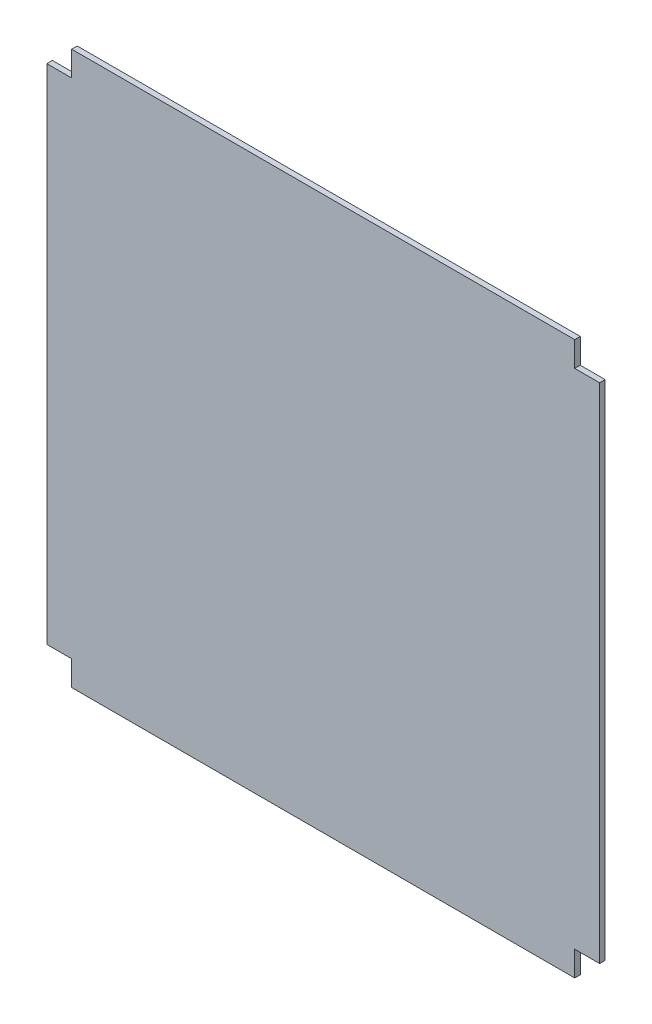
ISO-10303-21;
HEADER;
FILE_DESCRIPTION(('STEP AP214'),'2;1');
FILE_NAME('part.step','',(''),(''),'','','');
FILE_SCHEMA(('AUTOMOTIVE_DESIGN { 1 0 10303 214 1 1 1 1 }'));
ENDSEC;
DATA;
#1=APPLICATION_CONTEXT('core data for automotive mechanical design processes');
#2=APPLICATION_PROTOCOL_DEFINITION('international standard','automotive_design',2000,#1);
#3=PRODUCT_CONTEXT('',#1,'mechanical');
#4=PRODUCT('Part','Part','',(#3));
#5=PRODUCT_RELATED_PRODUCT_CATEGORY('part','',(#4));
#6=PRODUCT_DEFINITION_FORMATION('','',#4);
#7=PRODUCT_DEFINITION_CONTEXT('part definition',#1,'design');
#8=PRODUCT_DEFINITION('design','',#6,#7);
#9=PRODUCT_DEFINITION_SHAPE('','',#8);
#10=(LENGTH_UNIT() NAMED_UNIT(*) SI_UNIT(.MILLI.,.METRE.));
#11=(NAMED_UNIT(*) PLANE_ANGLE_UNIT() SI_UNIT($,.RADIAN.));
#12=(NAMED_UNIT(*) SI_UNIT($,.STERADIAN.) SOLID_ANGLE_UNIT());
#13=UNCERTAINTY_MEASURE_WITH_UNIT(LENGTH_MEASURE(1.E-05),#10,'distance_accuracy_value','');
#14=(GEOMETRIC_REPRESENTATION_CONTEXT(3) GLOBAL_UNCERTAINTY_ASSIGNED_CONTEXT((#13)) GLOBAL_UNIT_ASSIGNED_CONTEXT((#10,
#11,#12)) REPRESENTATION_CONTEXT('',''));
#15=CARTESIAN_POINT('',(0.,0.,0.));
#16=DIRECTION('',(0.,0.,1.));
#17=DIRECTION('',(1.,0.,0.));
#18=AXIS2_PLACEMENT_3D('',#15,#16,#17);
#19=CARTESIAN_POINT('',(339.840781697695,193.404508324807,5.08));
#20=DIRECTION('',(-1.,0.,0.));
#21=DIRECTION('',(0.,0.,1.));
#22=AXIS2_PLACEMENT_3D('',#19,#20,#21);
#23=PLANE('',#22);
#24=DIRECTION('',(0.,1.,0.));
#25=VECTOR('',#24,1.);
#26=CARTESIAN_POINT('',(339.840781697695,193.404508324807,0.));
#27=LINE('',#26,#25);
#28=CARTESIAN_POINT('',(339.840781697695,193.404508324807,0.));
#29=VERTEX_POINT('',#28);
#30=CARTESIAN_POINT('',(339.840781697695,216.264508324807,0.));
#31=VERTEX_POINT('',#30);
#32=EDGE_CURVE('E153',#29,#31,#27,.T.);
#33=ORIENTED_EDGE('',*,*,#32,.T.);
#34=DIRECTION('',(0.,0.,-1.));
#35=VECTOR('',#34,1.);
#36=CARTESIAN_POINT('',(339.840781697695,216.264508324807,5.08));
#37=LINE('',#36,#35);
#38=CARTESIAN_POINT('',(339.840781697695,216.264508324807,5.08));
#39=VERTEX_POINT('',#38);
#40=EDGE_CURVE('E11',#39,#31,#37,.T.);
#41=ORIENTED_EDGE('',*,*,#40,.F.);
#42=DIRECTION('',(0.,1.,0.));
#43=VECTOR('',#42,1.);
#44=CARTESIAN_POINT('',(339.840781697695,193.404508324807,5.08));
#45=LINE('',#44,#43);
#46=CARTESIAN_POINT('',(339.840781697695,193.404508324807,5.08));
#47=VERTEX_POINT('',#46);
#48=EDGE_CURVE('E175',#47,#39,#45,.T.);
#49=ORIENTED_EDGE('',*,*,#48,.F.);
#50=DIRECTION('',(0.,0.,-1.));
#51=VECTOR('',#50,1.);
#52=CARTESIAN_POINT('',(339.840781697695,193.404508324807,5.08));
#53=LINE('',#52,#51);
#54=EDGE_CURVE('E149',#47,#29,#53,.T.);
#55=ORIENTED_EDGE('',*,*,#54,.T.);
#56=EDGE_LOOP('',(#33,#41,#49,#55));
#57=FACE_BOUND('',#56,.T.);
#58=ADVANCED_FACE('F33',(#57),#23,.F.);
#59=CARTESIAN_POINT('',(339.840781697695,216.264508324807,5.08));
#60=DIRECTION('',(0.,-1.,0.));
#61=DIRECTION('',(1.,0.,0.));
#62=AXIS2_PLACEMENT_3D('',#59,#60,#61);
#63=PLANE('',#62);
#64=DIRECTION('',(-1.,0.,0.));
#65=VECTOR('',#64,1.);
#66=CARTESIAN_POINT('',(339.840781697695,216.264508324807,0.));
#67=LINE('',#66,#65);
#68=CARTESIAN_POINT('',(-121.423218302305,216.264508324807,0.));
#69=VERTEX_POINT('',#68);
#70=EDGE_CURVE('E156',#31,#69,#67,.T.);
#71=ORIENTED_EDGE('',*,*,#70,.T.);
#72=DIRECTION('',(0.,0.,-1.));
#73=VECTOR('',#72,1.);
#74=CARTESIAN_POINT('',(-121.423218302305,216.264508324807,5.08));
#75=LINE('',#74,#73);
#76=CARTESIAN_POINT('',(-121.423218302305,216.264508324807,5.08));
#77=VERTEX_POINT('',#76);
#78=EDGE_CURVE('E41',#77,#69,#75,.T.);
#79=ORIENTED_EDGE('',*,*,#78,.F.);
#80=DIRECTION('',(-1.,0.,0.));
#81=VECTOR('',#80,1.);
#82=CARTESIAN_POINT('',(339.840781697695,216.264508324807,5.08));
#83=LINE('',#82,#81);
#84=EDGE_CURVE('E104',#39,#77,#83,.T.);
#85=ORIENTED_EDGE('',*,*,#84,.F.);
#86=ORIENTED_EDGE('',*,*,#40,.T.);
#87=EDGE_LOOP('',(#71,#79,#85,#86));
#88=FACE_BOUND('',#87,.T.);
#89=ADVANCED_FACE('F253',(#88),#63,.F.);
#90=CARTESIAN_POINT('',(-121.423218302305,216.264508324807,5.08));
#91=DIRECTION('',(1.,0.,0.));
#92=DIRECTION('',(0.,1.,0.));
#93=AXIS2_PLACEMENT_3D('',#90,#91,#92);
#94=PLANE('',#93);
#95=DIRECTION('',(0.,-1.,0.));
#96=VECTOR('',#95,1.);
#97=CARTESIAN_POINT('',(-121.423218302305,216.264508324807,0.));
#98=LINE('',#97,#96);
#99=CARTESIAN_POINT('',(-121.423218302305,193.404508324808,0.));
#100=VERTEX_POINT('',#99);
#101=EDGE_CURVE('E158',#69,#100,#98,.T.);
#102=ORIENTED_EDGE('',*,*,#101,.T.);
#103=DIRECTION('',(0.,0.,-1.));
#104=VECTOR('',#103,1.);
#105=CARTESIAN_POINT('',(-121.423218302305,193.404508324808,5.08));
#106=LINE('',#105,#104);
#107=CARTESIAN_POINT('',(-121.423218302305,193.404508324808,5.08));
#108=VERTEX_POINT('',#107);
#109=EDGE_CURVE('E194',#108,#100,#106,.T.);
#110=ORIENTED_EDGE('',*,*,#109,.F.);
#111=DIRECTION('',(0.,-1.,0.));
#112=VECTOR('',#111,1.);
#113=CARTESIAN_POINT('',(-121.423218302305,216.264508324807,5.08));
#114=LINE('',#113,#112);
#115=EDGE_CURVE('E202',#77,#108,#114,.T.);
#116=ORIENTED_EDGE('',*,*,#115,.F.);
#117=ORIENTED_EDGE('',*,*,#78,.T.);
#118=EDGE_LOOP('',(#102,#110,#116,#117));
#119=FACE_BOUND('',#118,.T.);
#120=ADVANCED_FACE('F200',(#119),#94,.F.);
#121=CARTESIAN_POINT('',(-121.423218302305,193.404508324808,5.08));
#122=DIRECTION('',(0.,-1.,0.));
#123=DIRECTION('',(0.,0.,-1.));
#124=AXIS2_PLACEMENT_3D('',#121,#122,#123);
#125=PLANE('',#124);
#126=DIRECTION('',(-1.,0.,0.));
#127=VECTOR('',#126,1.);
#128=CARTESIAN_POINT('',(-121.423218302305,193.404508324808,0.));
#129=LINE('',#128,#127);
#130=CARTESIAN_POINT('',(-144.283218302305,193.404508324808,0.));
#131=VERTEX_POINT('',#130);
#132=EDGE_CURVE('E160',#100,#131,#129,.T.);
#133=ORIENTED_EDGE('',*,*,#132,.T.);
#134=DIRECTION('',(0.,0.,-1.));
#135=VECTOR('',#134,1.);
#136=CARTESIAN_POINT('',(-144.283218302305,193.404508324808,5.08));
#137=LINE('',#136,#135);
#138=CARTESIAN_POINT('',(-144.283218302305,193.404508324808,5.08));
#139=VERTEX_POINT('',#138);
#140=EDGE_CURVE('E191',#139,#131,#137,.T.);
#141=ORIENTED_EDGE('',*,*,#140,.F.);
#142=DIRECTION('',(-1.,0.,0.));
#143=VECTOR('',#142,1.);
#144=CARTESIAN_POINT('',(-121.423218302305,193.404508324808,5.08));
#145=LINE('',#144,#143);
#146=EDGE_CURVE('E220',#108,#139,#145,.T.);
#147=ORIENTED_EDGE('',*,*,#146,.F.);
#148=ORIENTED_EDGE('',*,*,#109,.T.);
#149=EDGE_LOOP('',(#133,#141,#147,#148));
#150=FACE_BOUND('',#149,.T.);
#151=ADVANCED_FACE('F211',(#150),#125,.F.);
#152=CARTESIAN_POINT('',(-144.283218302305,193.404508324808,5.08));
#153=DIRECTION('',(1.,0.,0.));
#154=DIRECTION('',(0.,1.,0.));
#155=AXIS2_PLACEMENT_3D('',#152,#153,#154);
#156=PLANE('',#155);
#157=DIRECTION('',(0.,-1.,0.));
#158=VECTOR('',#157,1.);
#159=CARTESIAN_POINT('',(-144.283218302305,193.404508324808,0.));
#160=LINE('',#159,#158);
#161=CARTESIAN_POINT('',(-144.283218302305,-267.859491675192,0.));
#162=VERTEX_POINT('',#161);
#163=EDGE_CURVE('E162',#131,#162,#160,.T.);
#164=ORIENTED_EDGE('',*,*,#163,.T.);
#165=DIRECTION('',(0.,0.,-1.));
#166=VECTOR('',#165,1.);
#167=CARTESIAN_POINT('',(-144.283218302305,-267.859491675192,5.08));
#168=LINE('',#167,#166);
#169=CARTESIAN_POINT('',(-144.283218302305,-267.859491675192,5.08));
#170=VERTEX_POINT('',#169);
#171=EDGE_CURVE('E188',#170,#162,#168,.T.);
#172=ORIENTED_EDGE('',*,*,#171,.F.);
#173=DIRECTION('',(0.,-1.,0.));
#174=VECTOR('',#173,1.);
#175=CARTESIAN_POINT('',(-144.283218302305,193.404508324808,5.08));
#176=LINE('',#175,#174);
#177=EDGE_CURVE('E217',#139,#170,#176,.T.);
#178=ORIENTED_EDGE('',*,*,#177,.F.);
#179=ORIENTED_EDGE('',*,*,#140,.T.);
#180=EDGE_LOOP('',(#164,#172,#178,#179));
#181=FACE_BOUND('',#180,.T.);
#182=ADVANCED_FACE('F215',(#181),#156,.F.);
#183=CARTESIAN_POINT('',(-144.283218302305,-267.859491675192,5.08));
#184=DIRECTION('',(0.,1.,0.));
#185=DIRECTION('',(0.,0.,1.));
#186=AXIS2_PLACEMENT_3D('',#183,#184,#185);
#187=PLANE('',#186);
#188=DIRECTION('',(1.,0.,0.));
#189=VECTOR('',#188,1.);
#190=CARTESIAN_POINT('',(-144.283218302305,-267.859491675192,0.));
#191=LINE('',#190,#189);
#192=CARTESIAN_POINT('',(-121.423218302305,-267.859491675192,0.));
#193=VERTEX_POINT('',#192);
#194=EDGE_CURVE('E164',#162,#193,#191,.T.);
#195=ORIENTED_EDGE('',*,*,#194,.T.);
#196=DIRECTION('',(0.,0.,-1.));
#197=VECTOR('',#196,1.);
#198=CARTESIAN_POINT('',(-121.423218302305,-267.859491675192,5.08));
#199=LINE('',#198,#197);
#200=CARTESIAN_POINT('',(-121.423218302305,-267.859491675192,5.08));
#201=VERTEX_POINT('',#200);
#202=EDGE_CURVE('E185',#201,#193,#199,.T.);
#203=ORIENTED_EDGE('',*,*,#202,.F.);
#204=DIRECTION('',(1.,0.,0.));
#205=VECTOR('',#204,1.);
#206=CARTESIAN_POINT('',(-144.283218302305,-267.859491675192,5.08));
#207=LINE('',#206,#205);
#208=EDGE_CURVE('E219',#170,#201,#207,.T.);
#209=ORIENTED_EDGE('',*,*,#208,.F.);
#210=ORIENTED_EDGE('',*,*,#171,.T.);
#211=EDGE_LOOP('',(#195,#203,#209,#210));
#212=FACE_BOUND('',#211,.T.);
#213=ADVANCED_FACE('F266',(#212),#187,.F.);
#214=CARTESIAN_POINT('',(-121.423218302305,-267.859491675192,5.08));
#215=DIRECTION('',(1.,0.,0.));
#216=DIRECTION('',(0.,1.,0.));
#217=AXIS2_PLACEMENT_3D('',#214,#215,#216);
#218=PLANE('',#217);
#219=DIRECTION('',(0.,-1.,0.));
#220=VECTOR('',#219,1.);
#221=CARTESIAN_POINT('',(-121.423218302305,-267.859491675192,0.));
#222=LINE('',#221,#220);
#223=CARTESIAN_POINT('',(-121.423218302305,-290.719491675192,0.));
#224=VERTEX_POINT('',#223);
#225=EDGE_CURVE('E166',#193,#224,#222,.T.);
#226=ORIENTED_EDGE('',*,*,#225,.T.);
#227=DIRECTION('',(0.,0.,-1.));
#228=VECTOR('',#227,1.);
#229=CARTESIAN_POINT('',(-121.423218302305,-290.719491675192,5.08));
#230=LINE('',#229,#228);
#231=CARTESIAN_POINT('',(-121.423218302305,-290.719491675192,5.08));
#232=VERTEX_POINT('',#231);
#233=EDGE_CURVE('E182',#232,#224,#230,.T.);
#234=ORIENTED_EDGE('',*,*,#233,.F.);
#235=DIRECTION('',(0.,-1.,0.));
#236=VECTOR('',#235,1.);
#237=CARTESIAN_POINT('',(-121.423218302305,-267.859491675192,5.08));
#238=LINE('',#237,#236);
#239=EDGE_CURVE('E222',#201,#232,#238,.T.);
#240=ORIENTED_EDGE('',*,*,#239,.F.);
#241=ORIENTED_EDGE('',*,*,#202,.T.);
#242=EDGE_LOOP('',(#226,#234,#240,#241));
#243=FACE_BOUND('',#242,.T.);
#244=ADVANCED_FACE('F269',(#243),#218,.F.);
#245=CARTESIAN_POINT('',(-121.423218302305,-290.719491675192,5.08));
#246=DIRECTION('',(0.,1.,0.));
#247=DIRECTION('',(-1.,0.,0.));
#248=AXIS2_PLACEMENT_3D('',#245,#246,#247);
#249=PLANE('',#248);
#250=DIRECTION('',(1.,0.,0.));
#251=VECTOR('',#250,1.);
#252=CARTESIAN_POINT('',(-121.423218302305,-290.719491675192,0.));
#253=LINE('',#252,#251);
#254=CARTESIAN_POINT('',(339.840781697695,-290.719491675192,0.));
#255=VERTEX_POINT('',#254);
#256=EDGE_CURVE('E168',#224,#255,#253,.T.);
#257=ORIENTED_EDGE('',*,*,#256,.T.);
#258=DIRECTION('',(0.,0.,-1.));
#259=VECTOR('',#258,1.);
#260=CARTESIAN_POINT('',(339.840781697695,-290.719491675192,5.08));
#261=LINE('',#260,#259);
#262=CARTESIAN_POINT('',(339.840781697695,-290.719491675192,5.08));
#263=VERTEX_POINT('',#262);
#264=EDGE_CURVE('E179',#263,#255,#261,.T.);
#265=ORIENTED_EDGE('',*,*,#264,.F.);
#266=DIRECTION('',(1.,0.,0.));
#267=VECTOR('',#266,1.);
#268=CARTESIAN_POINT('',(-121.423218302305,-290.719491675192,5.08));
#269=LINE('',#268,#267);
#270=EDGE_CURVE('E228',#232,#263,#269,.T.);
#271=ORIENTED_EDGE('',*,*,#270,.F.);
#272=ORIENTED_EDGE('',*,*,#233,.T.);
#273=EDGE_LOOP('',(#257,#265,#271,#272));
#274=FACE_BOUND('',#273,.T.);
#275=ADVANCED_FACE('F234',(#274),#249,.F.);
#276=CARTESIAN_POINT('',(339.840781697695,-290.719491675192,5.08));
#277=DIRECTION('',(-1.,0.,0.));
#278=DIRECTION('',(0.,0.,1.));
#279=AXIS2_PLACEMENT_3D('',#276,#277,#278);
#280=PLANE('',#279);
#281=DIRECTION('',(0.,1.,0.));
#282=VECTOR('',#281,1.);
#283=CARTESIAN_POINT('',(339.840781697695,-290.719491675192,0.));
#284=LINE('',#283,#282);
#285=CARTESIAN_POINT('',(339.840781697695,-267.859491675192,0.));
#286=VERTEX_POINT('',#285);
#287=EDGE_CURVE('E170',#255,#286,#284,.T.);
#288=ORIENTED_EDGE('',*,*,#287,.T.);
#289=DIRECTION('',(0.,0.,-1.));
#290=VECTOR('',#289,1.);
#291=CARTESIAN_POINT('',(339.840781697695,-267.859491675192,5.08));
#292=LINE('',#291,#290);
#293=CARTESIAN_POINT('',(339.840781697695,-267.859491675192,5.08));
#294=VERTEX_POINT('',#293);
#295=EDGE_CURVE('E144',#294,#286,#292,.T.);
#296=ORIENTED_EDGE('',*,*,#295,.F.);
#297=DIRECTION('',(0.,1.,0.));
#298=VECTOR('',#297,1.);
#299=CARTESIAN_POINT('',(339.840781697695,-290.719491675192,5.08));
#300=LINE('',#299,#298);
#301=EDGE_CURVE('E135',#263,#294,#300,.T.);
#302=ORIENTED_EDGE('',*,*,#301,.F.);
#303=ORIENTED_EDGE('',*,*,#264,.T.);
#304=EDGE_LOOP('',(#288,#296,#302,#303));
#305=FACE_BOUND('',#304,.T.);
#306=ADVANCED_FACE('F238',(#305),#280,.F.);
#307=CARTESIAN_POINT('',(339.840781697695,-267.859491675192,5.08));
#308=DIRECTION('',(0.,1.,0.));
#309=DIRECTION('',(0.,0.,1.));
#310=AXIS2_PLACEMENT_3D('',#307,#308,#309);
#311=PLANE('',#310);
#312=DIRECTION('',(1.,0.,0.));
#313=VECTOR('',#312,1.);
#314=CARTESIAN_POINT('',(339.840781697695,-267.859491675192,0.));
#315=LINE('',#314,#313);
#316=CARTESIAN_POINT('',(362.700781697695,-267.859491675192,0.));
#317=VERTEX_POINT('',#316);
#318=EDGE_CURVE('E143',#286,#317,#315,.T.);
#319=ORIENTED_EDGE('',*,*,#318,.T.);
#320=DIRECTION('',(0.,0.,-1.));
#321=VECTOR('',#320,1.);
#322=CARTESIAN_POINT('',(362.700781697695,-267.859491675192,5.08));
#323=LINE('',#322,#321);
#324=CARTESIAN_POINT('',(362.700781697695,-267.859491675192,5.08));
#325=VERTEX_POINT('',#324);
#326=EDGE_CURVE('E140',#325,#317,#323,.T.);
#327=ORIENTED_EDGE('',*,*,#326,.F.);
#328=DIRECTION('',(1.,0.,0.));
#329=VECTOR('',#328,1.);
#330=CARTESIAN_POINT('',(339.840781697695,-267.859491675192,5.08));
#331=LINE('',#330,#329);
#332=EDGE_CURVE('E129',#294,#325,#331,.T.);
#333=ORIENTED_EDGE('',*,*,#332,.F.);
#334=ORIENTED_EDGE('',*,*,#295,.T.);
#335=EDGE_LOOP('',(#319,#327,#333,#334));
#336=FACE_BOUND('',#335,.T.);
#337=ADVANCED_FACE('F141',(#336),#311,.F.);
#338=CARTESIAN_POINT('',(362.700781697695,-267.859491675192,5.08));
#339=DIRECTION('',(-1.,0.,0.));
#340=DIRECTION('',(0.,0.,1.));
#341=AXIS2_PLACEMENT_3D('',#338,#339,#340);
#342=PLANE('',#341);
#343=DIRECTION('',(0.,1.,0.));
#344=VECTOR('',#343,1.);
#345=CARTESIAN_POINT('',(362.700781697695,-267.859491675192,0.));
#346=LINE('',#345,#344);
#347=CARTESIAN_POINT('',(362.700781697695,193.404508324807,0.));
#348=VERTEX_POINT('',#347);
#349=EDGE_CURVE('E90',#317,#348,#346,.T.);
#350=ORIENTED_EDGE('',*,*,#349,.T.);
#351=DIRECTION('',(0.,0.,-1.));
#352=VECTOR('',#351,1.);
#353=CARTESIAN_POINT('',(362.700781697695,193.404508324807,5.08));
#354=LINE('',#353,#352);
#355=CARTESIAN_POINT('',(362.700781697695,193.404508324807,5.08));
#356=VERTEX_POINT('',#355);
#357=EDGE_CURVE('E145',#356,#348,#354,.T.);
#358=ORIENTED_EDGE('',*,*,#357,.F.);
#359=DIRECTION('',(0.,1.,0.));
#360=VECTOR('',#359,1.);
#361=CARTESIAN_POINT('',(362.700781697695,-267.859491675192,5.08));
#362=LINE('',#361,#360);
#363=EDGE_CURVE('E133',#325,#356,#362,.T.);
#364=ORIENTED_EDGE('',*,*,#363,.F.);
#365=ORIENTED_EDGE('',*,*,#326,.T.);
#366=EDGE_LOOP('',(#350,#358,#364,#365));
#367=FACE_BOUND('',#366,.T.);
#368=ADVANCED_FACE('F147',(#367),#342,.F.);
#369=CARTESIAN_POINT('',(362.700781697695,193.404508324807,5.08));
#370=DIRECTION('',(0.,-1.,0.));
#371=DIRECTION('',(0.,0.,-1.));
#372=AXIS2_PLACEMENT_3D('',#369,#370,#371);
#373=PLANE('',#372);
#374=DIRECTION('',(-1.,0.,0.));
#375=VECTOR('',#374,1.);
#376=CARTESIAN_POINT('',(362.700781697695,193.404508324807,0.));
#377=LINE('',#376,#375);
#378=EDGE_CURVE('E96',#348,#29,#377,.T.);
#379=ORIENTED_EDGE('',*,*,#378,.T.);
#380=ORIENTED_EDGE('',*,*,#54,.F.);
#381=DIRECTION('',(-1.,0.,0.));
#382=VECTOR('',#381,1.);
#383=CARTESIAN_POINT('',(362.700781697695,193.404508324807,5.08));
#384=LINE('',#383,#382);
#385=EDGE_CURVE('E49',#356,#47,#384,.T.);
#386=ORIENTED_EDGE('',*,*,#385,.F.);
#387=ORIENTED_EDGE('',*,*,#357,.T.);
#388=EDGE_LOOP('',(#379,#380,#386,#387));
#389=FACE_BOUND('',#388,.T.);
#390=ADVANCED_FACE('F242',(#389),#373,.F.);
#391=CARTESIAN_POINT('',(0.,0.,5.08));
#392=DIRECTION('',(0.,0.,1.));
#393=DIRECTION('',(1.,0.,0.));
#394=AXIS2_PLACEMENT_3D('',#391,#392,#393);
#395=PLANE('',#394);
#396=ORIENTED_EDGE('',*,*,#48,.T.);
#397=ORIENTED_EDGE('',*,*,#84,.T.);
#398=ORIENTED_EDGE('',*,*,#115,.T.);
#399=ORIENTED_EDGE('',*,*,#146,.T.);
#400=ORIENTED_EDGE('',*,*,#177,.T.);
#401=ORIENTED_EDGE('',*,*,#208,.T.);
#402=ORIENTED_EDGE('',*,*,#239,.T.);
#403=ORIENTED_EDGE('',*,*,#270,.T.);
#404=ORIENTED_EDGE('',*,*,#301,.T.);
#405=ORIENTED_EDGE('',*,*,#332,.T.);
#406=ORIENTED_EDGE('',*,*,#363,.T.);
#407=ORIENTED_EDGE('',*,*,#385,.T.);
#408=EDGE_LOOP('',(#396,#397,#398,#399,#400,#401,#402,#403,#404,#405,#406,#407));
#409=FACE_BOUND('',#408,.T.);
#410=ADVANCED_FACE('F131',(#409),#395,.T.);
#411=CARTESIAN_POINT('',(0.,0.,0.));
#412=DIRECTION('',(0.,0.,1.));
#413=DIRECTION('',(1.,0.,0.));
#414=AXIS2_PLACEMENT_3D('',#411,#412,#413);
#415=PLANE('',#414);
#416=ORIENTED_EDGE('',*,*,#32,.F.);
#417=ORIENTED_EDGE('',*,*,#378,.F.);
#418=ORIENTED_EDGE('',*,*,#349,.F.);
#419=ORIENTED_EDGE('',*,*,#318,.F.);
#420=ORIENTED_EDGE('',*,*,#287,.F.);
#421=ORIENTED_EDGE('',*,*,#256,.F.);
#422=ORIENTED_EDGE('',*,*,#225,.F.);
#423=ORIENTED_EDGE('',*,*,#194,.F.);
#424=ORIENTED_EDGE('',*,*,#163,.F.);
#425=ORIENTED_EDGE('',*,*,#132,.F.);
#426=ORIENTED_EDGE('',*,*,#101,.F.);
#427=ORIENTED_EDGE('',*,*,#70,.F.);
#428=EDGE_LOOP('',(#416,#417,#418,#419,#420,#421,#422,#423,#424,#425,#426,#427));
#429=FACE_BOUND('',#428,.T.);
#430=ADVANCED_FACE('F206',(#429),#415,.F.);
#431=CLOSED_SHELL('',(#58,#89,#120,#151,#182,#213,#244,#275,#306,#337,#368,#390,#410,#430));
#432=MANIFOLD_SOLID_BREP('B2',#431);
#433=ADVANCED_BREP_SHAPE_REPRESENTATION('',(#18,#432),#14);
#434=SHAPE_DEFINITION_REPRESENTATION(#9,#433);
ENDSEC;
END-ISO-10303-21;
